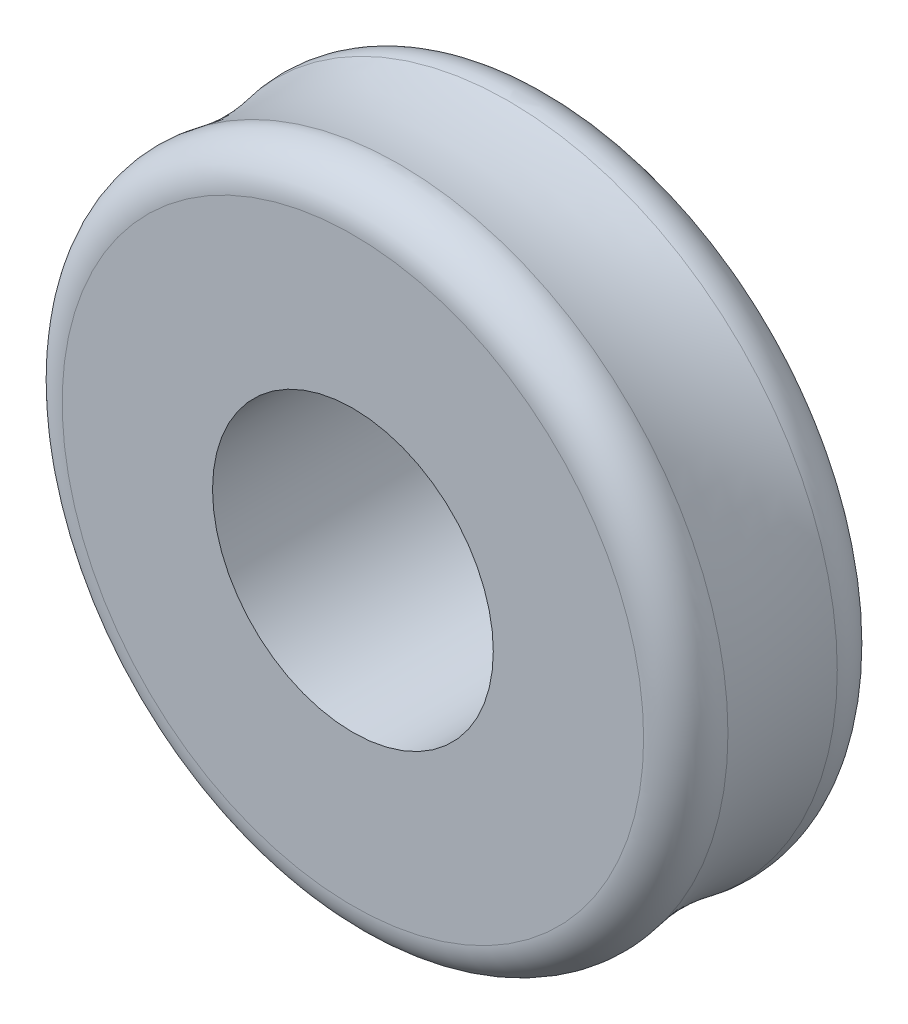
ISO-10303-21;
HEADER;
FILE_DESCRIPTION(('STEP AP214'),'2;1');
FILE_NAME('part.step','',(''),(''),'','','');
FILE_SCHEMA(('AUTOMOTIVE_DESIGN { 1 0 10303 214 1 1 1 1 }'));
ENDSEC;
DATA;
#1=APPLICATION_CONTEXT('core data for automotive mechanical design processes');
#2=APPLICATION_PROTOCOL_DEFINITION('international standard','automotive_design',2000,#1);
#3=PRODUCT_CONTEXT('',#1,'mechanical');
#4=PRODUCT('Part','Part','',(#3));
#5=PRODUCT_RELATED_PRODUCT_CATEGORY('part','',(#4));
#6=PRODUCT_DEFINITION_FORMATION('','',#4);
#7=PRODUCT_DEFINITION_CONTEXT('part definition',#1,'design');
#8=PRODUCT_DEFINITION('design','',#6,#7);
#9=PRODUCT_DEFINITION_SHAPE('','',#8);
#10=(LENGTH_UNIT() NAMED_UNIT(*) SI_UNIT(.MILLI.,.METRE.));
#11=(NAMED_UNIT(*) PLANE_ANGLE_UNIT() SI_UNIT($,.RADIAN.));
#12=(NAMED_UNIT(*) SI_UNIT($,.STERADIAN.) SOLID_ANGLE_UNIT());
#13=UNCERTAINTY_MEASURE_WITH_UNIT(LENGTH_MEASURE(1.E-05),#10,'distance_accuracy_value','');
#14=(GEOMETRIC_REPRESENTATION_CONTEXT(3) GLOBAL_UNCERTAINTY_ASSIGNED_CONTEXT((#13)) GLOBAL_UNIT_ASSIGNED_CONTEXT((#10,
#11,#12)) REPRESENTATION_CONTEXT('',''));
#15=CARTESIAN_POINT('',(0.,0.,0.));
#16=DIRECTION('',(0.,0.,1.));
#17=DIRECTION('',(1.,0.,0.));
#18=AXIS2_PLACEMENT_3D('',#15,#16,#17);
#19=CARTESIAN_POINT('',(0.,0.,2.6162));
#20=DIRECTION('',(0.,0.,1.));
#21=DIRECTION('',(1.,0.,0.));
#22=AXIS2_PLACEMENT_3D('',#19,#20,#21);
#23=PLANE('',#22);
#24=CARTESIAN_POINT('',(0.,0.,2.6162));
#25=DIRECTION('',(0.,0.,1.));
#26=DIRECTION('',(1.,0.,0.));
#27=AXIS2_PLACEMENT_3D('',#24,#25,#26);
#28=CIRCLE('',#27,3.76114179595825);
#29=CARTESIAN_POINT('',(3.76114179595825,0.,2.6162));
#30=VERTEX_POINT('',#29);
#31=EDGE_CURVE('E47',#30,#30,#28,.T.);
#32=ORIENTED_EDGE('',*,*,#31,.T.);
#33=EDGE_LOOP('',(#32));
#34=FACE_BOUND('',#33,.T.);
#35=CARTESIAN_POINT('',(0.,0.,2.6162));
#36=DIRECTION('',(0.,0.,1.));
#37=DIRECTION('',(1.,0.,0.));
#38=AXIS2_PLACEMENT_3D('',#35,#36,#37);
#39=CIRCLE('',#38,1.8161);
#40=CARTESIAN_POINT('',(1.8161,0.,2.6162));
#41=VERTEX_POINT('',#40);
#42=EDGE_CURVE('E52',#41,#41,#39,.T.);
#43=ORIENTED_EDGE('',*,*,#42,.F.);
#44=EDGE_LOOP('',(#43));
#45=FACE_BOUND('',#44,.T.);
#46=ADVANCED_FACE('F32',(#34,#45),#23,.T.);
#47=CARTESIAN_POINT('',(0.,0.,0.));
#48=DIRECTION('',(0.,0.,1.));
#49=DIRECTION('',(1.,0.,0.));
#50=AXIS2_PLACEMENT_3D('',#47,#48,#49);
#51=PLANE('',#50);
#52=CARTESIAN_POINT('',(0.,0.,0.));
#53=DIRECTION('',(0.,0.,1.));
#54=DIRECTION('',(1.,0.,0.));
#55=AXIS2_PLACEMENT_3D('',#52,#53,#54);
#56=CIRCLE('',#55,3.76114179595825);
#57=CARTESIAN_POINT('',(3.76114179595825,0.,0.));
#58=VERTEX_POINT('',#57);
#59=EDGE_CURVE('E10',#58,#58,#56,.F.);
#60=ORIENTED_EDGE('',*,*,#59,.T.);
#61=EDGE_LOOP('',(#60));
#62=FACE_BOUND('',#61,.T.);
#63=CARTESIAN_POINT('',(0.,0.,0.));
#64=DIRECTION('',(0.,0.,1.));
#65=DIRECTION('',(1.,0.,0.));
#66=AXIS2_PLACEMENT_3D('',#63,#64,#65);
#67=CIRCLE('',#66,1.8161);
#68=CARTESIAN_POINT('',(1.8161,0.,0.));
#69=VERTEX_POINT('',#68);
#70=EDGE_CURVE('E53',#69,#69,#67,.T.);
#71=ORIENTED_EDGE('',*,*,#70,.T.);
#72=EDGE_LOOP('',(#71));
#73=FACE_BOUND('',#72,.T.);
#74=ADVANCED_FACE('F63',(#62,#73),#51,.F.);
#75=CARTESIAN_POINT('',(0.,0.,2.6162));
#76=DIRECTION('',(0.,0.,-1.));
#77=DIRECTION('',(-1.,0.,0.));
#78=AXIS2_PLACEMENT_3D('',#75,#76,#77);
#79=CYLINDRICAL_SURFACE('',#78,1.8161);
#80=ORIENTED_EDGE('',*,*,#42,.T.);
#81=EDGE_LOOP('',(#80));
#82=FACE_BOUND('',#81,.T.);
#83=ORIENTED_EDGE('',*,*,#70,.F.);
#84=EDGE_LOOP('',(#83));
#85=FACE_BOUND('',#84,.T.);
#86=ADVANCED_FACE('F59',(#82,#85),#79,.F.);
#87=CARTESIAN_POINT('',(0.,0.,1.3081));
#88=DIRECTION('',(0.,0.,1.));
#89=DIRECTION('',(1.,0.,0.));
#90=AXIS2_PLACEMENT_3D('',#87,#88,#89);
#91=TOROIDAL_SURFACE('',#90,7.67866325601434,3.5);
#92=CARTESIAN_POINT('',(0.,0.,2.0151875));
#93=DIRECTION('',(0.,0.,-1.));
#94=DIRECTION('',(-1.,0.,0.));
#95=AXIS2_PLACEMENT_3D('',#92,#93,#94);
#96=CIRCLE('',#95,4.25083197846526);
#97=CARTESIAN_POINT('',(-4.25083197846526,0.,2.0151875));
#98=VERTEX_POINT('',#97);
#99=EDGE_CURVE('E39',#98,#98,#96,.T.);
#100=ORIENTED_EDGE('',*,*,#99,.T.);
#101=EDGE_LOOP('',(#100));
#102=FACE_BOUND('',#101,.T.);
#103=CARTESIAN_POINT('',(0.,0.,0.6010125));
#104=DIRECTION('',(0.,0.,1.));
#105=DIRECTION('',(1.,0.,0.));
#106=AXIS2_PLACEMENT_3D('',#103,#104,#105);
#107=CIRCLE('',#106,4.25083197846526);
#108=CARTESIAN_POINT('',(4.25083197846526,0.,0.6010125));
#109=VERTEX_POINT('',#108);
#110=EDGE_CURVE('E43',#109,#109,#107,.T.);
#111=ORIENTED_EDGE('',*,*,#110,.T.);
#112=EDGE_LOOP('',(#111));
#113=FACE_BOUND('',#112,.T.);
#114=ADVANCED_FACE('F74',(#102,#113),#91,.F.);
#115=CARTESIAN_POINT('',(0.,0.,2.1162));
#116=DIRECTION('',(0.,0.,-1.));
#117=DIRECTION('',(-1.,0.,0.));
#118=AXIS2_PLACEMENT_3D('',#115,#116,#117);
#119=TOROIDAL_SURFACE('',#118,3.76114179595825,0.5);
#120=ORIENTED_EDGE('',*,*,#99,.F.);
#121=EDGE_LOOP('',(#120));
#122=FACE_BOUND('',#121,.T.);
#123=ORIENTED_EDGE('',*,*,#31,.F.);
#124=EDGE_LOOP('',(#123));
#125=FACE_BOUND('',#124,.T.);
#126=ADVANCED_FACE('F72',(#122,#125),#119,.T.);
#127=CARTESIAN_POINT('',(0.,0.,0.5));
#128=DIRECTION('',(0.,0.,-1.));
#129=DIRECTION('',(-1.,0.,0.));
#130=AXIS2_PLACEMENT_3D('',#127,#128,#129);
#131=TOROIDAL_SURFACE('',#130,3.76114179595825,0.5);
#132=ORIENTED_EDGE('',*,*,#59,.F.);
#133=EDGE_LOOP('',(#132));
#134=FACE_BOUND('',#133,.T.);
#135=ORIENTED_EDGE('',*,*,#110,.F.);
#136=EDGE_LOOP('',(#135));
#137=FACE_BOUND('',#136,.T.);
#138=ADVANCED_FACE('F34',(#134,#137),#131,.T.);
#139=CLOSED_SHELL('',(#46,#74,#86,#114,#126,#138));
#140=MANIFOLD_SOLID_BREP('B2',#139);
#141=ADVANCED_BREP_SHAPE_REPRESENTATION('',(#18,#140),#14);
#142=SHAPE_DEFINITION_REPRESENTATION(#9,#141);
ENDSEC;
END-ISO-10303-21;
